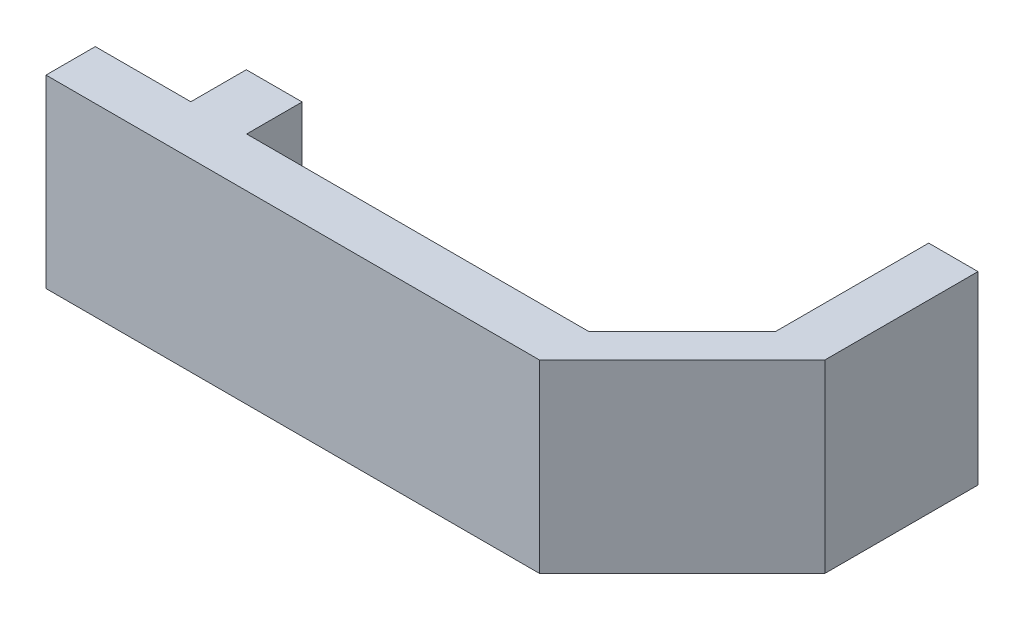
ISO-10303-21;
HEADER;
FILE_DESCRIPTION(('STEP AP214'),'2;1');
FILE_NAME('part.step','',(''),(''),'','','');
FILE_SCHEMA(('AUTOMOTIVE_DESIGN { 1 0 10303 214 1 1 1 1 }'));
ENDSEC;
DATA;
#1=APPLICATION_CONTEXT('core data for automotive mechanical design processes');
#2=APPLICATION_PROTOCOL_DEFINITION('international standard','automotive_design',2000,#1);
#3=PRODUCT_CONTEXT('',#1,'mechanical');
#4=PRODUCT('Part','Part','',(#3));
#5=PRODUCT_RELATED_PRODUCT_CATEGORY('part','',(#4));
#6=PRODUCT_DEFINITION_FORMATION('','',#4);
#7=PRODUCT_DEFINITION_CONTEXT('part definition',#1,'design');
#8=PRODUCT_DEFINITION('design','',#6,#7);
#9=PRODUCT_DEFINITION_SHAPE('','',#8);
#10=(LENGTH_UNIT() NAMED_UNIT(*) SI_UNIT(.MILLI.,.METRE.));
#11=(NAMED_UNIT(*) PLANE_ANGLE_UNIT() SI_UNIT($,.RADIAN.));
#12=(NAMED_UNIT(*) SI_UNIT($,.STERADIAN.) SOLID_ANGLE_UNIT());
#13=UNCERTAINTY_MEASURE_WITH_UNIT(LENGTH_MEASURE(1.E-05),#10,'distance_accuracy_value','');
#14=(GEOMETRIC_REPRESENTATION_CONTEXT(3) GLOBAL_UNCERTAINTY_ASSIGNED_CONTEXT((#13)) GLOBAL_UNIT_ASSIGNED_CONTEXT((#10,
#11,#12)) REPRESENTATION_CONTEXT('',''));
#15=CARTESIAN_POINT('',(0.,0.,0.));
#16=DIRECTION('',(0.,0.,1.));
#17=DIRECTION('',(1.,0.,0.));
#18=AXIS2_PLACEMENT_3D('',#15,#16,#17);
#19=CARTESIAN_POINT('',(-27.5017231924407,15.,-6.85925925925926));
#20=DIRECTION('',(1.,0.,0.));
#21=DIRECTION('',(0.,0.,-1.));
#22=AXIS2_PLACEMENT_3D('',#19,#20,#21);
#23=PLANE('',#22);
#24=DIRECTION('',(0.,0.,1.));
#25=VECTOR('',#24,1.);
#26=CARTESIAN_POINT('',(-27.5017231924407,0.,-6.85925925925926));
#27=LINE('',#26,#25);
#28=CARTESIAN_POINT('',(-27.5017231924407,0.,-6.85925925925926));
#29=VERTEX_POINT('',#28);
#30=CARTESIAN_POINT('',(-27.5017231924407,0.,-2.35925925925926));
#31=VERTEX_POINT('',#30);
#32=EDGE_CURVE('E156',#29,#31,#27,.T.);
#33=ORIENTED_EDGE('',*,*,#32,.T.);
#34=DIRECTION('',(0.,-1.,0.));
#35=VECTOR('',#34,1.);
#36=CARTESIAN_POINT('',(-27.5017231924407,15.,-2.35925925925926));
#37=LINE('',#36,#35);
#38=CARTESIAN_POINT('',(-27.5017231924407,15.,-2.35925925925926));
#39=VERTEX_POINT('',#38);
#40=EDGE_CURVE('E11',#39,#31,#37,.T.);
#41=ORIENTED_EDGE('',*,*,#40,.F.);
#42=DIRECTION('',(0.,0.,1.));
#43=VECTOR('',#42,1.);
#44=CARTESIAN_POINT('',(-27.5017231924407,15.,-6.85925925925926));
#45=LINE('',#44,#43);
#46=CARTESIAN_POINT('',(-27.5017231924407,15.,-6.85925925925926));
#47=VERTEX_POINT('',#46);
#48=EDGE_CURVE('E178',#47,#39,#45,.T.);
#49=ORIENTED_EDGE('',*,*,#48,.F.);
#50=DIRECTION('',(0.,-1.,0.));
#51=VECTOR('',#50,1.);
#52=CARTESIAN_POINT('',(-27.5017231924407,15.,-6.85925925925926));
#53=LINE('',#52,#51);
#54=EDGE_CURVE('E152',#47,#29,#53,.T.);
#55=ORIENTED_EDGE('',*,*,#54,.T.);
#56=EDGE_LOOP('',(#33,#41,#49,#55));
#57=FACE_BOUND('',#56,.T.);
#58=ADVANCED_FACE('F36',(#57),#23,.F.);
#59=CARTESIAN_POINT('',(-27.5017231924407,15.,-2.35925925925926));
#60=DIRECTION('',(0.,0.,1.));
#61=DIRECTION('',(1.,0.,0.));
#62=AXIS2_PLACEMENT_3D('',#59,#60,#61);
#63=PLANE('',#62);
#64=DIRECTION('',(-1.,0.,0.));
#65=VECTOR('',#64,1.);
#66=CARTESIAN_POINT('',(-27.5017231924407,0.,-2.35925925925926));
#67=LINE('',#66,#65);
#68=CARTESIAN_POINT('',(-35.2517231924407,0.,-2.35925925925926));
#69=VERTEX_POINT('',#68);
#70=EDGE_CURVE('E159',#31,#69,#67,.T.);
#71=ORIENTED_EDGE('',*,*,#70,.T.);
#72=DIRECTION('',(0.,-1.,0.));
#73=VECTOR('',#72,1.);
#74=CARTESIAN_POINT('',(-35.2517231924407,15.,-2.35925925925926));
#75=LINE('',#74,#73);
#76=CARTESIAN_POINT('',(-35.2517231924407,15.,-2.35925925925926));
#77=VERTEX_POINT('',#76);
#78=EDGE_CURVE('E44',#77,#69,#75,.T.);
#79=ORIENTED_EDGE('',*,*,#78,.F.);
#80=DIRECTION('',(-1.,0.,0.));
#81=VECTOR('',#80,1.);
#82=CARTESIAN_POINT('',(-27.5017231924407,15.,-2.35925925925926));
#83=LINE('',#82,#81);
#84=EDGE_CURVE('E107',#39,#77,#83,.T.);
#85=ORIENTED_EDGE('',*,*,#84,.F.);
#86=ORIENTED_EDGE('',*,*,#40,.T.);
#87=EDGE_LOOP('',(#71,#79,#85,#86));
#88=FACE_BOUND('',#87,.T.);
#89=ADVANCED_FACE('F256',(#88),#63,.F.);
#90=CARTESIAN_POINT('',(-35.2517231924407,15.,-2.35925925925926));
#91=DIRECTION('',(1.,0.,0.));
#92=DIRECTION('',(0.,0.,-1.));
#93=AXIS2_PLACEMENT_3D('',#90,#91,#92);
#94=PLANE('',#93);
#95=DIRECTION('',(0.,0.,1.));
#96=VECTOR('',#95,1.);
#97=CARTESIAN_POINT('',(-35.2517231924407,0.,-2.35925925925926));
#98=LINE('',#97,#96);
#99=CARTESIAN_POINT('',(-35.2517231924407,0.,1.64074074074074));
#100=VERTEX_POINT('',#99);
#101=EDGE_CURVE('E161',#69,#100,#98,.T.);
#102=ORIENTED_EDGE('',*,*,#101,.T.);
#103=DIRECTION('',(0.,-1.,0.));
#104=VECTOR('',#103,1.);
#105=CARTESIAN_POINT('',(-35.2517231924407,15.,1.64074074074074));
#106=LINE('',#105,#104);
#107=CARTESIAN_POINT('',(-35.2517231924407,15.,1.64074074074074));
#108=VERTEX_POINT('',#107);
#109=EDGE_CURVE('E197',#108,#100,#106,.T.);
#110=ORIENTED_EDGE('',*,*,#109,.F.);
#111=DIRECTION('',(0.,0.,1.));
#112=VECTOR('',#111,1.);
#113=CARTESIAN_POINT('',(-35.2517231924407,15.,-2.35925925925926));
#114=LINE('',#113,#112);
#115=EDGE_CURVE('E205',#77,#108,#114,.T.);
#116=ORIENTED_EDGE('',*,*,#115,.F.);
#117=ORIENTED_EDGE('',*,*,#78,.T.);
#118=EDGE_LOOP('',(#102,#110,#116,#117));
#119=FACE_BOUND('',#118,.T.);
#120=ADVANCED_FACE('F203',(#119),#94,.F.);
#121=CARTESIAN_POINT('',(-35.2517231924407,15.,1.64074074074074));
#122=DIRECTION('',(0.,0.,-1.));
#123=DIRECTION('',(-1.,0.,0.));
#124=AXIS2_PLACEMENT_3D('',#121,#122,#123);
#125=PLANE('',#124);
#126=DIRECTION('',(1.,0.,0.));
#127=VECTOR('',#126,1.);
#128=CARTESIAN_POINT('',(-35.2517231924407,0.,1.64074074074074));
#129=LINE('',#128,#127);
#130=CARTESIAN_POINT('',(4.77827680755932,0.,1.64074074074074));
#131=VERTEX_POINT('',#130);
#132=EDGE_CURVE('E163',#100,#131,#129,.T.);
#133=ORIENTED_EDGE('',*,*,#132,.T.);
#134=DIRECTION('',(0.,-1.,0.));
#135=VECTOR('',#134,1.);
#136=CARTESIAN_POINT('',(4.77827680755932,15.,1.64074074074074));
#137=LINE('',#136,#135);
#138=CARTESIAN_POINT('',(4.77827680755932,15.,1.64074074074074));
#139=VERTEX_POINT('',#138);
#140=EDGE_CURVE('E194',#139,#131,#137,.T.);
#141=ORIENTED_EDGE('',*,*,#140,.F.);
#142=DIRECTION('',(1.,0.,0.));
#143=VECTOR('',#142,1.);
#144=CARTESIAN_POINT('',(-35.2517231924407,15.,1.64074074074074));
#145=LINE('',#144,#143);
#146=EDGE_CURVE('E223',#108,#139,#145,.T.);
#147=ORIENTED_EDGE('',*,*,#146,.F.);
#148=ORIENTED_EDGE('',*,*,#109,.T.);
#149=EDGE_LOOP('',(#133,#141,#147,#148));
#150=FACE_BOUND('',#149,.T.);
#151=ADVANCED_FACE('F214',(#150),#125,.F.);
#152=CARTESIAN_POINT('',(4.77827680755932,15.,1.64074074074074));
#153=DIRECTION('',(-0.707106781186547,0.,-0.707106781186548));
#154=DIRECTION('',(-0.707106781186548,0.,0.707106781186547));
#155=AXIS2_PLACEMENT_3D('',#152,#153,#154);
#156=PLANE('',#155);
#157=DIRECTION('',(0.707106781186548,0.,-0.707106781186547));
#158=VECTOR('',#157,1.);
#159=CARTESIAN_POINT('',(4.77827680755932,0.,1.64074074074074));
#160=LINE('',#159,#158);
#161=CARTESIAN_POINT('',(16.3616101408926,0.,-9.94259259259256));
#162=VERTEX_POINT('',#161);
#163=EDGE_CURVE('E165',#131,#162,#160,.T.);
#164=ORIENTED_EDGE('',*,*,#163,.T.);
#165=DIRECTION('',(0.,-1.,0.));
#166=VECTOR('',#165,1.);
#167=CARTESIAN_POINT('',(16.3616101408926,15.,-9.94259259259256));
#168=LINE('',#167,#166);
#169=CARTESIAN_POINT('',(16.3616101408926,15.,-9.94259259259256));
#170=VERTEX_POINT('',#169);
#171=EDGE_CURVE('E191',#170,#162,#168,.T.);
#172=ORIENTED_EDGE('',*,*,#171,.F.);
#173=DIRECTION('',(0.707106781186548,0.,-0.707106781186547));
#174=VECTOR('',#173,1.);
#175=CARTESIAN_POINT('',(4.77827680755932,15.,1.64074074074074));
#176=LINE('',#175,#174);
#177=EDGE_CURVE('E220',#139,#170,#176,.T.);
#178=ORIENTED_EDGE('',*,*,#177,.F.);
#179=ORIENTED_EDGE('',*,*,#140,.T.);
#180=EDGE_LOOP('',(#164,#172,#178,#179));
#181=FACE_BOUND('',#180,.T.);
#182=ADVANCED_FACE('F218',(#181),#156,.F.);
#183=CARTESIAN_POINT('',(16.3616101408926,15.,-22.3592592592593));
#184=DIRECTION('',(-1.,0.,0.));
#185=DIRECTION('',(0.,0.,1.));
#186=AXIS2_PLACEMENT_3D('',#183,#184,#185);
#187=PLANE('',#186);
#188=DIRECTION('',(0.,0.,-1.));
#189=VECTOR('',#188,1.);
#190=CARTESIAN_POINT('',(16.3616101408926,0.,-22.3592592592593));
#191=LINE('',#190,#189);
#192=CARTESIAN_POINT('',(16.3616101408926,0.,-22.3592592592593));
#193=VERTEX_POINT('',#192);
#194=EDGE_CURVE('E167',#162,#193,#191,.T.);
#195=ORIENTED_EDGE('',*,*,#194,.T.);
#196=DIRECTION('',(0.,-1.,0.));
#197=VECTOR('',#196,1.);
#198=CARTESIAN_POINT('',(16.3616101408926,15.,-22.3592592592593));
#199=LINE('',#198,#197);
#200=CARTESIAN_POINT('',(16.3616101408926,15.,-22.3592592592593));
#201=VERTEX_POINT('',#200);
#202=EDGE_CURVE('E188',#201,#193,#199,.T.);
#203=ORIENTED_EDGE('',*,*,#202,.F.);
#204=DIRECTION('',(0.,0.,-1.));
#205=VECTOR('',#204,1.);
#206=CARTESIAN_POINT('',(16.3616101408926,15.,-22.3592592592593));
#207=LINE('',#206,#205);
#208=EDGE_CURVE('E222',#170,#201,#207,.T.);
#209=ORIENTED_EDGE('',*,*,#208,.F.);
#210=ORIENTED_EDGE('',*,*,#171,.T.);
#211=EDGE_LOOP('',(#195,#203,#209,#210));
#212=FACE_BOUND('',#211,.T.);
#213=ADVANCED_FACE('F269',(#212),#187,.F.);
#214=CARTESIAN_POINT('',(12.3616101408926,15.,-22.3592592592593));
#215=DIRECTION('',(0.,0.,1.));
#216=DIRECTION('',(1.,0.,0.));
#217=AXIS2_PLACEMENT_3D('',#214,#215,#216);
#218=PLANE('',#217);
#219=DIRECTION('',(-1.,0.,0.));
#220=VECTOR('',#219,1.);
#221=CARTESIAN_POINT('',(12.3616101408926,0.,-22.3592592592593));
#222=LINE('',#221,#220);
#223=CARTESIAN_POINT('',(12.3616101408926,0.,-22.3592592592593));
#224=VERTEX_POINT('',#223);
#225=EDGE_CURVE('E169',#193,#224,#222,.T.);
#226=ORIENTED_EDGE('',*,*,#225,.T.);
#227=DIRECTION('',(0.,-1.,0.));
#228=VECTOR('',#227,1.);
#229=CARTESIAN_POINT('',(12.3616101408926,15.,-22.3592592592593));
#230=LINE('',#229,#228);
#231=CARTESIAN_POINT('',(12.3616101408926,15.,-22.3592592592593));
#232=VERTEX_POINT('',#231);
#233=EDGE_CURVE('E185',#232,#224,#230,.T.);
#234=ORIENTED_EDGE('',*,*,#233,.F.);
#235=DIRECTION('',(-1.,0.,0.));
#236=VECTOR('',#235,1.);
#237=CARTESIAN_POINT('',(12.3616101408926,15.,-22.3592592592593));
#238=LINE('',#237,#236);
#239=EDGE_CURVE('E225',#201,#232,#238,.T.);
#240=ORIENTED_EDGE('',*,*,#239,.F.);
#241=ORIENTED_EDGE('',*,*,#202,.T.);
#242=EDGE_LOOP('',(#226,#234,#240,#241));
#243=FACE_BOUND('',#242,.T.);
#244=ADVANCED_FACE('F272',(#243),#218,.F.);
#245=CARTESIAN_POINT('',(12.3616101408926,15.,-9.94259259259256));
#246=DIRECTION('',(1.,0.,0.));
#247=DIRECTION('',(0.,0.,-1.));
#248=AXIS2_PLACEMENT_3D('',#245,#246,#247);
#249=PLANE('',#248);
#250=DIRECTION('',(0.,0.,1.));
#251=VECTOR('',#250,1.);
#252=CARTESIAN_POINT('',(12.3616101408926,0.,-9.94259259259256));
#253=LINE('',#252,#251);
#254=CARTESIAN_POINT('',(12.3616101408926,0.,-9.94259259259256));
#255=VERTEX_POINT('',#254);
#256=EDGE_CURVE('E171',#224,#255,#253,.T.);
#257=ORIENTED_EDGE('',*,*,#256,.T.);
#258=DIRECTION('',(0.,-1.,0.));
#259=VECTOR('',#258,1.);
#260=CARTESIAN_POINT('',(12.3616101408926,15.,-9.94259259259256));
#261=LINE('',#260,#259);
#262=CARTESIAN_POINT('',(12.3616101408926,15.,-9.94259259259256));
#263=VERTEX_POINT('',#262);
#264=EDGE_CURVE('E182',#263,#255,#261,.T.);
#265=ORIENTED_EDGE('',*,*,#264,.F.);
#266=DIRECTION('',(0.,0.,1.));
#267=VECTOR('',#266,1.);
#268=CARTESIAN_POINT('',(12.3616101408926,15.,-9.94259259259256));
#269=LINE('',#268,#267);
#270=EDGE_CURVE('E231',#232,#263,#269,.T.);
#271=ORIENTED_EDGE('',*,*,#270,.F.);
#272=ORIENTED_EDGE('',*,*,#233,.T.);
#273=EDGE_LOOP('',(#257,#265,#271,#272));
#274=FACE_BOUND('',#273,.T.);
#275=ADVANCED_FACE('F237',(#274),#249,.F.);
#276=CARTESIAN_POINT('',(4.77827680755932,15.,-2.35925925925926));
#277=DIRECTION('',(0.707106781186548,0.,0.707106781186548));
#278=DIRECTION('',(0.707106781186548,0.,-0.707106781186547));
#279=AXIS2_PLACEMENT_3D('',#276,#277,#278);
#280=PLANE('',#279);
#281=DIRECTION('',(-0.707106781186548,0.,0.707106781186547));
#282=VECTOR('',#281,1.);
#283=CARTESIAN_POINT('',(4.77827680755932,0.,-2.35925925925926));
#284=LINE('',#283,#282);
#285=CARTESIAN_POINT('',(4.77827680755932,0.,-2.35925925925926));
#286=VERTEX_POINT('',#285);
#287=EDGE_CURVE('E173',#255,#286,#284,.T.);
#288=ORIENTED_EDGE('',*,*,#287,.T.);
#289=DIRECTION('',(0.,-1.,0.));
#290=VECTOR('',#289,1.);
#291=CARTESIAN_POINT('',(4.77827680755932,15.,-2.35925925925926));
#292=LINE('',#291,#290);
#293=CARTESIAN_POINT('',(4.77827680755932,15.,-2.35925925925926));
#294=VERTEX_POINT('',#293);
#295=EDGE_CURVE('E147',#294,#286,#292,.T.);
#296=ORIENTED_EDGE('',*,*,#295,.F.);
#297=DIRECTION('',(-0.707106781186548,0.,0.707106781186547));
#298=VECTOR('',#297,1.);
#299=CARTESIAN_POINT('',(4.77827680755932,15.,-2.35925925925926));
#300=LINE('',#299,#298);
#301=EDGE_CURVE('E138',#263,#294,#300,.T.);
#302=ORIENTED_EDGE('',*,*,#301,.F.);
#303=ORIENTED_EDGE('',*,*,#264,.T.);
#304=EDGE_LOOP('',(#288,#296,#302,#303));
#305=FACE_BOUND('',#304,.T.);
#306=ADVANCED_FACE('F241',(#305),#280,.F.);
#307=CARTESIAN_POINT('',(-22.9717231924407,15.,-2.35925925925926));
#308=DIRECTION('',(0.,0.,1.));
#309=DIRECTION('',(1.,0.,0.));
#310=AXIS2_PLACEMENT_3D('',#307,#308,#309);
#311=PLANE('',#310);
#312=DIRECTION('',(-1.,0.,0.));
#313=VECTOR('',#312,1.);
#314=CARTESIAN_POINT('',(-22.9717231924407,0.,-2.35925925925926));
#315=LINE('',#314,#313);
#316=CARTESIAN_POINT('',(-22.9717231924407,0.,-2.35925925925926));
#317=VERTEX_POINT('',#316);
#318=EDGE_CURVE('E146',#286,#317,#315,.T.);
#319=ORIENTED_EDGE('',*,*,#318,.T.);
#320=DIRECTION('',(0.,-1.,0.));
#321=VECTOR('',#320,1.);
#322=CARTESIAN_POINT('',(-22.9717231924407,15.,-2.35925925925926));
#323=LINE('',#322,#321);
#324=CARTESIAN_POINT('',(-22.9717231924407,15.,-2.35925925925926));
#325=VERTEX_POINT('',#324);
#326=EDGE_CURVE('E143',#325,#317,#323,.T.);
#327=ORIENTED_EDGE('',*,*,#326,.F.);
#328=DIRECTION('',(-1.,0.,0.));
#329=VECTOR('',#328,1.);
#330=CARTESIAN_POINT('',(-22.9717231924407,15.,-2.35925925925926));
#331=LINE('',#330,#329);
#332=EDGE_CURVE('E132',#294,#325,#331,.T.);
#333=ORIENTED_EDGE('',*,*,#332,.F.);
#334=ORIENTED_EDGE('',*,*,#295,.T.);
#335=EDGE_LOOP('',(#319,#327,#333,#334));
#336=FACE_BOUND('',#335,.T.);
#337=ADVANCED_FACE('F144',(#336),#311,.F.);
#338=CARTESIAN_POINT('',(-22.9717231924407,15.,-6.85925925925926));
#339=DIRECTION('',(-1.,0.,0.));
#340=DIRECTION('',(0.,0.,1.));
#341=AXIS2_PLACEMENT_3D('',#338,#339,#340);
#342=PLANE('',#341);
#343=DIRECTION('',(0.,0.,-1.));
#344=VECTOR('',#343,1.);
#345=CARTESIAN_POINT('',(-22.9717231924407,0.,-6.85925925925926));
#346=LINE('',#345,#344);
#347=CARTESIAN_POINT('',(-22.9717231924407,0.,-6.85925925925926));
#348=VERTEX_POINT('',#347);
#349=EDGE_CURVE('E93',#317,#348,#346,.T.);
#350=ORIENTED_EDGE('',*,*,#349,.T.);
#351=DIRECTION('',(0.,-1.,0.));
#352=VECTOR('',#351,1.);
#353=CARTESIAN_POINT('',(-22.9717231924407,15.,-6.85925925925926));
#354=LINE('',#353,#352);
#355=CARTESIAN_POINT('',(-22.9717231924407,15.,-6.85925925925926));
#356=VERTEX_POINT('',#355);
#357=EDGE_CURVE('E148',#356,#348,#354,.T.);
#358=ORIENTED_EDGE('',*,*,#357,.F.);
#359=DIRECTION('',(0.,0.,-1.));
#360=VECTOR('',#359,1.);
#361=CARTESIAN_POINT('',(-22.9717231924407,15.,-6.85925925925926));
#362=LINE('',#361,#360);
#363=EDGE_CURVE('E136',#325,#356,#362,.T.);
#364=ORIENTED_EDGE('',*,*,#363,.F.);
#365=ORIENTED_EDGE('',*,*,#326,.T.);
#366=EDGE_LOOP('',(#350,#358,#364,#365));
#367=FACE_BOUND('',#366,.T.);
#368=ADVANCED_FACE('F150',(#367),#342,.F.);
#369=CARTESIAN_POINT('',(-27.5017231924407,15.,-6.85925925925926));
#370=DIRECTION('',(0.,0.,1.));
#371=DIRECTION('',(1.,0.,0.));
#372=AXIS2_PLACEMENT_3D('',#369,#370,#371);
#373=PLANE('',#372);
#374=DIRECTION('',(-1.,0.,0.));
#375=VECTOR('',#374,1.);
#376=CARTESIAN_POINT('',(-27.5017231924407,0.,-6.85925925925926));
#377=LINE('',#376,#375);
#378=EDGE_CURVE('E99',#348,#29,#377,.T.);
#379=ORIENTED_EDGE('',*,*,#378,.T.);
#380=ORIENTED_EDGE('',*,*,#54,.F.);
#381=DIRECTION('',(-1.,0.,0.));
#382=VECTOR('',#381,1.);
#383=CARTESIAN_POINT('',(-27.5017231924407,15.,-6.85925925925926));
#384=LINE('',#383,#382);
#385=EDGE_CURVE('E52',#356,#47,#384,.T.);
#386=ORIENTED_EDGE('',*,*,#385,.F.);
#387=ORIENTED_EDGE('',*,*,#357,.T.);
#388=EDGE_LOOP('',(#379,#380,#386,#387));
#389=FACE_BOUND('',#388,.T.);
#390=ADVANCED_FACE('F245',(#389),#373,.F.);
#391=CARTESIAN_POINT('',(0.,15.,0.));
#392=DIRECTION('',(0.,-1.,0.));
#393=DIRECTION('',(0.,0.,-1.));
#394=AXIS2_PLACEMENT_3D('',#391,#392,#393);
#395=PLANE('',#394);
#396=ORIENTED_EDGE('',*,*,#48,.T.);
#397=ORIENTED_EDGE('',*,*,#84,.T.);
#398=ORIENTED_EDGE('',*,*,#115,.T.);
#399=ORIENTED_EDGE('',*,*,#146,.T.);
#400=ORIENTED_EDGE('',*,*,#177,.T.);
#401=ORIENTED_EDGE('',*,*,#208,.T.);
#402=ORIENTED_EDGE('',*,*,#239,.T.);
#403=ORIENTED_EDGE('',*,*,#270,.T.);
#404=ORIENTED_EDGE('',*,*,#301,.T.);
#405=ORIENTED_EDGE('',*,*,#332,.T.);
#406=ORIENTED_EDGE('',*,*,#363,.T.);
#407=ORIENTED_EDGE('',*,*,#385,.T.);
#408=EDGE_LOOP('',(#396,#397,#398,#399,#400,#401,#402,#403,#404,#405,#406,#407));
#409=FACE_BOUND('',#408,.T.);
#410=ADVANCED_FACE('F134',(#409),#395,.F.);
#411=CARTESIAN_POINT('',(0.,0.,0.));
#412=DIRECTION('',(0.,-1.,0.));
#413=DIRECTION('',(0.,0.,-1.));
#414=AXIS2_PLACEMENT_3D('',#411,#412,#413);
#415=PLANE('',#414);
#416=ORIENTED_EDGE('',*,*,#32,.F.);
#417=ORIENTED_EDGE('',*,*,#378,.F.);
#418=ORIENTED_EDGE('',*,*,#349,.F.);
#419=ORIENTED_EDGE('',*,*,#318,.F.);
#420=ORIENTED_EDGE('',*,*,#287,.F.);
#421=ORIENTED_EDGE('',*,*,#256,.F.);
#422=ORIENTED_EDGE('',*,*,#225,.F.);
#423=ORIENTED_EDGE('',*,*,#194,.F.);
#424=ORIENTED_EDGE('',*,*,#163,.F.);
#425=ORIENTED_EDGE('',*,*,#132,.F.);
#426=ORIENTED_EDGE('',*,*,#101,.F.);
#427=ORIENTED_EDGE('',*,*,#70,.F.);
#428=EDGE_LOOP('',(#416,#417,#418,#419,#420,#421,#422,#423,#424,#425,#426,#427));
#429=FACE_BOUND('',#428,.T.);
#430=ADVANCED_FACE('F209',(#429),#415,.T.);
#431=CLOSED_SHELL('',(#58,#89,#120,#151,#182,#213,#244,#275,#306,#337,#368,#390,#410,#430));
#432=MANIFOLD_SOLID_BREP('B2',#431);
#433=ADVANCED_BREP_SHAPE_REPRESENTATION('',(#18,#432),#14);
#434=SHAPE_DEFINITION_REPRESENTATION(#9,#433);
ENDSEC;
END-ISO-10303-21;
